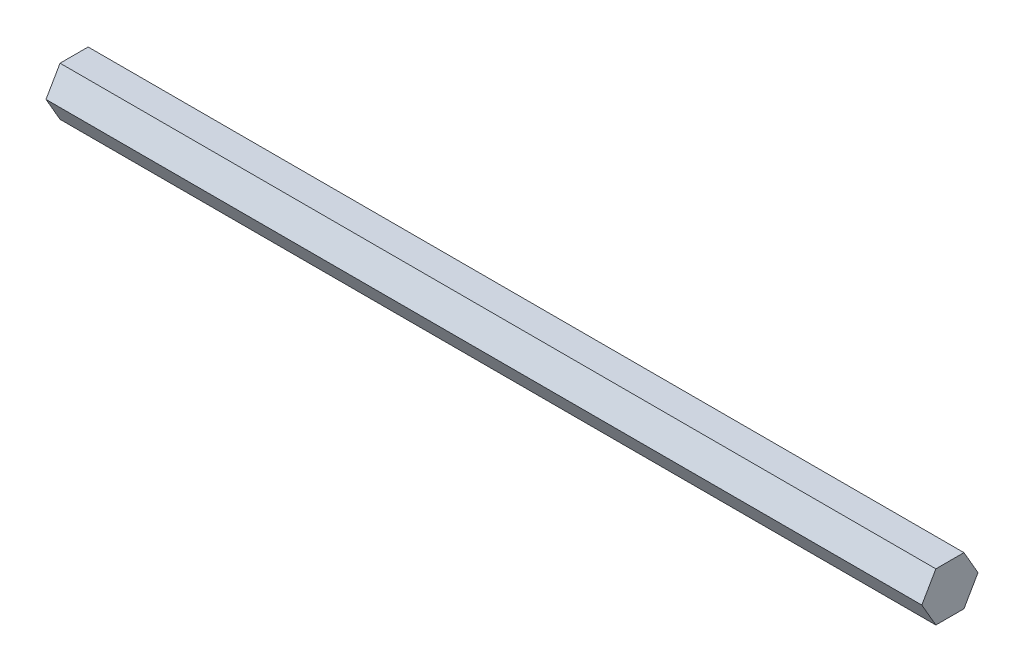
ISO-10303-21;
HEADER;
FILE_DESCRIPTION(('STEP AP214'),'2;1');
FILE_NAME('part.step','',(''),(''),'','','');
FILE_SCHEMA(('AUTOMOTIVE_DESIGN { 1 0 10303 214 1 1 1 1 }'));
ENDSEC;
DATA;
#1=APPLICATION_CONTEXT('core data for automotive mechanical design processes');
#2=APPLICATION_PROTOCOL_DEFINITION('international standard','automotive_design',2000,#1);
#3=PRODUCT_CONTEXT('',#1,'mechanical');
#4=PRODUCT('Part','Part','',(#3));
#5=PRODUCT_RELATED_PRODUCT_CATEGORY('part','',(#4));
#6=PRODUCT_DEFINITION_FORMATION('','',#4);
#7=PRODUCT_DEFINITION_CONTEXT('part definition',#1,'design');
#8=PRODUCT_DEFINITION('design','',#6,#7);
#9=PRODUCT_DEFINITION_SHAPE('','',#8);
#10=(LENGTH_UNIT() NAMED_UNIT(*) SI_UNIT(.MILLI.,.METRE.));
#11=(NAMED_UNIT(*) PLANE_ANGLE_UNIT() SI_UNIT($,.RADIAN.));
#12=(NAMED_UNIT(*) SI_UNIT($,.STERADIAN.) SOLID_ANGLE_UNIT());
#13=UNCERTAINTY_MEASURE_WITH_UNIT(LENGTH_MEASURE(1.E-05),#10,'distance_accuracy_value','');
#14=(GEOMETRIC_REPRESENTATION_CONTEXT(3) GLOBAL_UNCERTAINTY_ASSIGNED_CONTEXT((#13)) GLOBAL_UNIT_ASSIGNED_CONTEXT((#10,
#11,#12)) REPRESENTATION_CONTEXT('',''));
#15=CARTESIAN_POINT('',(0.,0.,0.));
#16=DIRECTION('',(0.,0.,1.));
#17=DIRECTION('',(1.,0.,0.));
#18=AXIS2_PLACEMENT_3D('',#15,#16,#17);
#19=CARTESIAN_POINT('',(228.6,-6.35,3.66617420935412));
#20=DIRECTION('',(0.,-0.5,0.866025403784439));
#21=DIRECTION('',(0.,-0.866025403784439,-0.5));
#22=AXIS2_PLACEMENT_3D('',#19,#20,#21);
#23=PLANE('',#22);
#24=DIRECTION('',(0.,0.866025403784439,0.5));
#25=VECTOR('',#24,1.);
#26=CARTESIAN_POINT('',(0.,-6.35,3.66617420935412));
#27=LINE('',#26,#25);
#28=CARTESIAN_POINT('',(0.,-6.35,3.66617420935412));
#29=VERTEX_POINT('',#28);
#30=CARTESIAN_POINT('',(0.,0.,7.33234841870825));
#31=VERTEX_POINT('',#30);
#32=EDGE_CURVE('E128',#29,#31,#27,.T.);
#33=ORIENTED_EDGE('',*,*,#32,.F.);
#34=DIRECTION('',(-1.,0.,0.));
#35=VECTOR('',#34,1.);
#36=CARTESIAN_POINT('',(228.6,-6.35,3.66617420935412));
#37=LINE('',#36,#35);
#38=CARTESIAN_POINT('',(228.6,-6.35,3.66617420935412));
#39=VERTEX_POINT('',#38);
#40=EDGE_CURVE('E11',#39,#29,#37,.T.);
#41=ORIENTED_EDGE('',*,*,#40,.F.);
#42=DIRECTION('',(0.,0.866025403784439,0.5));
#43=VECTOR('',#42,1.);
#44=CARTESIAN_POINT('',(228.6,-6.35,3.66617420935412));
#45=LINE('',#44,#43);
#46=CARTESIAN_POINT('',(228.6,0.,7.33234841870825));
#47=VERTEX_POINT('',#46);
#48=EDGE_CURVE('E142',#39,#47,#45,.T.);
#49=ORIENTED_EDGE('',*,*,#48,.T.);
#50=DIRECTION('',(-1.,0.,0.));
#51=VECTOR('',#50,1.);
#52=CARTESIAN_POINT('',(228.6,0.,7.33234841870825));
#53=LINE('',#52,#51);
#54=EDGE_CURVE('E46',#47,#31,#53,.T.);
#55=ORIENTED_EDGE('',*,*,#54,.T.);
#56=EDGE_LOOP('',(#33,#41,#49,#55));
#57=FACE_BOUND('',#56,.T.);
#58=ADVANCED_FACE('F43',(#57),#23,.T.);
#59=CARTESIAN_POINT('',(228.6,-6.35,-3.66617420935413));
#60=DIRECTION('',(0.,-1.,0.));
#61=DIRECTION('',(0.,0.,-1.));
#62=AXIS2_PLACEMENT_3D('',#59,#60,#61);
#63=PLANE('',#62);
#64=DIRECTION('',(0.,0.,1.));
#65=VECTOR('',#64,1.);
#66=CARTESIAN_POINT('',(0.,-6.35,-3.66617420935413));
#67=LINE('',#66,#65);
#68=CARTESIAN_POINT('',(0.,-6.35,-3.66617420935413));
#69=VERTEX_POINT('',#68);
#70=EDGE_CURVE('E140',#69,#29,#67,.T.);
#71=ORIENTED_EDGE('',*,*,#70,.F.);
#72=DIRECTION('',(-1.,0.,0.));
#73=VECTOR('',#72,1.);
#74=CARTESIAN_POINT('',(228.6,-6.35,-3.66617420935413));
#75=LINE('',#74,#73);
#76=CARTESIAN_POINT('',(228.6,-6.35,-3.66617420935413));
#77=VERTEX_POINT('',#76);
#78=EDGE_CURVE('E52',#77,#69,#75,.T.);
#79=ORIENTED_EDGE('',*,*,#78,.F.);
#80=DIRECTION('',(0.,0.,1.));
#81=VECTOR('',#80,1.);
#82=CARTESIAN_POINT('',(228.6,-6.35,-3.66617420935413));
#83=LINE('',#82,#81);
#84=EDGE_CURVE('E118',#77,#39,#83,.T.);
#85=ORIENTED_EDGE('',*,*,#84,.T.);
#86=ORIENTED_EDGE('',*,*,#40,.T.);
#87=EDGE_LOOP('',(#71,#79,#85,#86));
#88=FACE_BOUND('',#87,.T.);
#89=ADVANCED_FACE('F150',(#88),#63,.T.);
#90=CARTESIAN_POINT('',(228.6,0.,-7.33234841870825));
#91=DIRECTION('',(0.,-0.5,-0.866025403784439));
#92=DIRECTION('',(0.,0.866025403784439,-0.5));
#93=AXIS2_PLACEMENT_3D('',#90,#91,#92);
#94=PLANE('',#93);
#95=DIRECTION('',(0.,-0.866025403784439,0.5));
#96=VECTOR('',#95,1.);
#97=CARTESIAN_POINT('',(0.,0.,-7.33234841870825));
#98=LINE('',#97,#96);
#99=CARTESIAN_POINT('',(0.,0.,-7.33234841870825));
#100=VERTEX_POINT('',#99);
#101=EDGE_CURVE('E105',#100,#69,#98,.T.);
#102=ORIENTED_EDGE('',*,*,#101,.F.);
#103=DIRECTION('',(-1.,0.,0.));
#104=VECTOR('',#103,1.);
#105=CARTESIAN_POINT('',(228.6,0.,-7.33234841870825));
#106=LINE('',#105,#104);
#107=CARTESIAN_POINT('',(228.6,0.,-7.33234841870825));
#108=VERTEX_POINT('',#107);
#109=EDGE_CURVE('E100',#108,#100,#106,.T.);
#110=ORIENTED_EDGE('',*,*,#109,.F.);
#111=DIRECTION('',(0.,-0.866025403784439,0.5));
#112=VECTOR('',#111,1.);
#113=CARTESIAN_POINT('',(228.6,0.,-7.33234841870825));
#114=LINE('',#113,#112);
#115=EDGE_CURVE('E103',#108,#77,#114,.T.);
#116=ORIENTED_EDGE('',*,*,#115,.T.);
#117=ORIENTED_EDGE('',*,*,#78,.T.);
#118=EDGE_LOOP('',(#102,#110,#116,#117));
#119=FACE_BOUND('',#118,.T.);
#120=ADVANCED_FACE('F102',(#119),#94,.T.);
#121=CARTESIAN_POINT('',(228.6,6.35,-3.66617420935413));
#122=DIRECTION('',(0.,0.5,-0.866025403784439));
#123=DIRECTION('',(0.,0.866025403784439,0.5));
#124=AXIS2_PLACEMENT_3D('',#121,#122,#123);
#125=PLANE('',#124);
#126=DIRECTION('',(0.,-0.866025403784439,-0.5));
#127=VECTOR('',#126,1.);
#128=CARTESIAN_POINT('',(0.,6.35,-3.66617420935413));
#129=LINE('',#128,#127);
#130=CARTESIAN_POINT('',(0.,6.35,-3.66617420935413));
#131=VERTEX_POINT('',#130);
#132=EDGE_CURVE('E137',#131,#100,#129,.T.);
#133=ORIENTED_EDGE('',*,*,#132,.F.);
#134=DIRECTION('',(-1.,0.,0.));
#135=VECTOR('',#134,1.);
#136=CARTESIAN_POINT('',(228.6,6.35,-3.66617420935413));
#137=LINE('',#136,#135);
#138=CARTESIAN_POINT('',(228.6,6.35,-3.66617420935413));
#139=VERTEX_POINT('',#138);
#140=EDGE_CURVE('E110',#139,#131,#137,.T.);
#141=ORIENTED_EDGE('',*,*,#140,.F.);
#142=DIRECTION('',(0.,-0.866025403784439,-0.5));
#143=VECTOR('',#142,1.);
#144=CARTESIAN_POINT('',(228.6,6.35,-3.66617420935413));
#145=LINE('',#144,#143);
#146=EDGE_CURVE('E116',#139,#108,#145,.T.);
#147=ORIENTED_EDGE('',*,*,#146,.T.);
#148=ORIENTED_EDGE('',*,*,#109,.T.);
#149=EDGE_LOOP('',(#133,#141,#147,#148));
#150=FACE_BOUND('',#149,.T.);
#151=ADVANCED_FACE('F120',(#150),#125,.T.);
#152=CARTESIAN_POINT('',(228.6,6.35,3.66617420935412));
#153=DIRECTION('',(0.,1.,0.));
#154=DIRECTION('',(0.,0.,1.));
#155=AXIS2_PLACEMENT_3D('',#152,#153,#154);
#156=PLANE('',#155);
#157=DIRECTION('',(0.,0.,-1.));
#158=VECTOR('',#157,1.);
#159=CARTESIAN_POINT('',(0.,6.35,3.66617420935412));
#160=LINE('',#159,#158);
#161=CARTESIAN_POINT('',(0.,6.35,3.66617420935412));
#162=VERTEX_POINT('',#161);
#163=EDGE_CURVE('E134',#162,#131,#160,.T.);
#164=ORIENTED_EDGE('',*,*,#163,.F.);
#165=DIRECTION('',(-1.,0.,0.));
#166=VECTOR('',#165,1.);
#167=CARTESIAN_POINT('',(228.6,6.35,3.66617420935412));
#168=LINE('',#167,#166);
#169=CARTESIAN_POINT('',(228.6,6.35,3.66617420935412));
#170=VERTEX_POINT('',#169);
#171=EDGE_CURVE('E145',#170,#162,#168,.T.);
#172=ORIENTED_EDGE('',*,*,#171,.F.);
#173=DIRECTION('',(0.,0.,-1.));
#174=VECTOR('',#173,1.);
#175=CARTESIAN_POINT('',(228.6,6.35,3.66617420935412));
#176=LINE('',#175,#174);
#177=EDGE_CURVE('E121',#170,#139,#176,.T.);
#178=ORIENTED_EDGE('',*,*,#177,.T.);
#179=ORIENTED_EDGE('',*,*,#140,.T.);
#180=EDGE_LOOP('',(#164,#172,#178,#179));
#181=FACE_BOUND('',#180,.T.);
#182=ADVANCED_FACE('F163',(#181),#156,.T.);
#183=CARTESIAN_POINT('',(228.6,0.,7.33234841870825));
#184=DIRECTION('',(0.,0.5,0.866025403784438));
#185=DIRECTION('',(0.,-0.866025403784439,0.5));
#186=AXIS2_PLACEMENT_3D('',#183,#184,#185);
#187=PLANE('',#186);
#188=DIRECTION('',(0.,0.866025403784438,-0.5));
#189=VECTOR('',#188,1.);
#190=CARTESIAN_POINT('',(0.,0.,7.33234841870825));
#191=LINE('',#190,#189);
#192=EDGE_CURVE('E131',#31,#162,#191,.T.);
#193=ORIENTED_EDGE('',*,*,#192,.F.);
#194=ORIENTED_EDGE('',*,*,#54,.F.);
#195=DIRECTION('',(0.,0.866025403784438,-0.5));
#196=VECTOR('',#195,1.);
#197=CARTESIAN_POINT('',(228.6,0.,7.33234841870825));
#198=LINE('',#197,#196);
#199=EDGE_CURVE('E123',#47,#170,#198,.T.);
#200=ORIENTED_EDGE('',*,*,#199,.T.);
#201=ORIENTED_EDGE('',*,*,#171,.T.);
#202=EDGE_LOOP('',(#193,#194,#200,#201));
#203=FACE_BOUND('',#202,.T.);
#204=ADVANCED_FACE('F147',(#203),#187,.T.);
#205=CARTESIAN_POINT('',(228.6,0.,0.));
#206=DIRECTION('',(-1.,0.,0.));
#207=DIRECTION('',(0.,0.,1.));
#208=AXIS2_PLACEMENT_3D('',#205,#206,#207);
#209=PLANE('',#208);
#210=ORIENTED_EDGE('',*,*,#48,.F.);
#211=ORIENTED_EDGE('',*,*,#84,.F.);
#212=ORIENTED_EDGE('',*,*,#115,.F.);
#213=ORIENTED_EDGE('',*,*,#146,.F.);
#214=ORIENTED_EDGE('',*,*,#177,.F.);
#215=ORIENTED_EDGE('',*,*,#199,.F.);
#216=EDGE_LOOP('',(#210,#211,#212,#213,#214,#215));
#217=FACE_BOUND('',#216,.T.);
#218=ADVANCED_FACE('F114',(#217),#209,.F.);
#219=CARTESIAN_POINT('',(0.,0.,0.));
#220=DIRECTION('',(-1.,0.,0.));
#221=DIRECTION('',(0.,0.,1.));
#222=AXIS2_PLACEMENT_3D('',#219,#220,#221);
#223=PLANE('',#222);
#224=ORIENTED_EDGE('',*,*,#32,.T.);
#225=ORIENTED_EDGE('',*,*,#192,.T.);
#226=ORIENTED_EDGE('',*,*,#163,.T.);
#227=ORIENTED_EDGE('',*,*,#132,.T.);
#228=ORIENTED_EDGE('',*,*,#101,.T.);
#229=ORIENTED_EDGE('',*,*,#70,.T.);
#230=EDGE_LOOP('',(#224,#225,#226,#227,#228,#229));
#231=FACE_BOUND('',#230,.T.);
#232=ADVANCED_FACE('F149',(#231),#223,.T.);
#233=CLOSED_SHELL('',(#58,#89,#120,#151,#182,#204,#218,#232));
#234=MANIFOLD_SOLID_BREP('B2',#233);
#235=ADVANCED_BREP_SHAPE_REPRESENTATION('',(#18,#234),#14);
#236=SHAPE_DEFINITION_REPRESENTATION(#9,#235);
ENDSEC;
END-ISO-10303-21;
